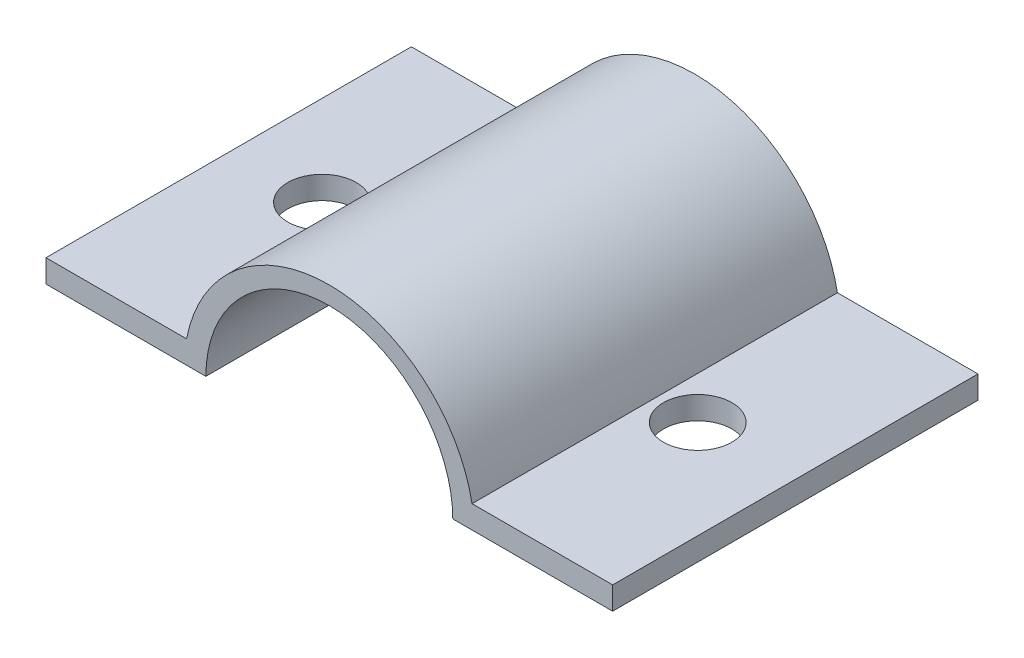
ISO-10303-21;
HEADER;
FILE_DESCRIPTION(('STEP AP214'),'2;1');
FILE_NAME('part.step','',(''),(''),'','','');
FILE_SCHEMA(('AUTOMOTIVE_DESIGN { 1 0 10303 214 1 1 1 1 }'));
ENDSEC;
DATA;
#1=APPLICATION_CONTEXT('core data for automotive mechanical design processes');
#2=APPLICATION_PROTOCOL_DEFINITION('international standard','automotive_design',2000,#1);
#3=PRODUCT_CONTEXT('',#1,'mechanical');
#4=PRODUCT('Part','Part','',(#3));
#5=PRODUCT_RELATED_PRODUCT_CATEGORY('part','',(#4));
#6=PRODUCT_DEFINITION_FORMATION('','',#4);
#7=PRODUCT_DEFINITION_CONTEXT('part definition',#1,'design');
#8=PRODUCT_DEFINITION('design','',#6,#7);
#9=PRODUCT_DEFINITION_SHAPE('','',#8);
#10=(LENGTH_UNIT() NAMED_UNIT(*) SI_UNIT(.MILLI.,.METRE.));
#11=(NAMED_UNIT(*) PLANE_ANGLE_UNIT() SI_UNIT($,.RADIAN.));
#12=(NAMED_UNIT(*) SI_UNIT($,.STERADIAN.) SOLID_ANGLE_UNIT());
#13=UNCERTAINTY_MEASURE_WITH_UNIT(LENGTH_MEASURE(1.E-05),#10,'distance_accuracy_value','');
#14=(GEOMETRIC_REPRESENTATION_CONTEXT(3) GLOBAL_UNCERTAINTY_ASSIGNED_CONTEXT((#13)) GLOBAL_UNIT_ASSIGNED_CONTEXT((#10,
#11,#12)) REPRESENTATION_CONTEXT('',''));
#15=CARTESIAN_POINT('',(0.,0.,0.));
#16=DIRECTION('',(0.,0.,1.));
#17=DIRECTION('',(1.,0.,0.));
#18=AXIS2_PLACEMENT_3D('',#15,#16,#17);
#19=CARTESIAN_POINT('',(1.79189292588689,-0.0212672986542654,16.));
#20=DIRECTION('',(0.,0.,-1.));
#21=DIRECTION('',(-1.,0.,0.));
#22=AXIS2_PLACEMENT_3D('',#19,#20,#21);
#23=CYLINDRICAL_SURFACE('',#22,5.4075061985006);
#24=CARTESIAN_POINT('',(1.79189292588689,-0.0212672986542654,0.));
#25=DIRECTION('',(0.,0.,-1.));
#26=DIRECTION('',(-1.,0.,0.));
#27=AXIS2_PLACEMENT_3D('',#24,#25,#26);
#28=CIRCLE('',#27,5.4075061985006);
#29=CARTESIAN_POINT('',(-3.61557145114144,0.,0.));
#30=VERTEX_POINT('',#29);
#31=CARTESIAN_POINT('',(7.19935730291522,0.,0.));
#32=VERTEX_POINT('',#31);
#33=EDGE_CURVE('E147',#30,#32,#28,.T.);
#34=ORIENTED_EDGE('',*,*,#33,.T.);
#35=DIRECTION('',(0.,0.,-1.));
#36=VECTOR('',#35,1.);
#37=CARTESIAN_POINT('',(7.19935730291522,0.,16.));
#38=LINE('',#37,#36);
#39=CARTESIAN_POINT('',(7.19935730291522,0.,16.));
#40=VERTEX_POINT('',#39);
#41=EDGE_CURVE('E11',#40,#32,#38,.T.);
#42=ORIENTED_EDGE('',*,*,#41,.F.);
#43=CARTESIAN_POINT('',(1.79189292588689,-0.0212672986542654,16.));
#44=DIRECTION('',(0.,0.,-1.));
#45=DIRECTION('',(-1.,0.,0.));
#46=AXIS2_PLACEMENT_3D('',#43,#44,#45);
#47=CIRCLE('',#46,5.4075061985006);
#48=CARTESIAN_POINT('',(-3.61557145114144,0.,16.));
#49=VERTEX_POINT('',#48);
#50=EDGE_CURVE('E170',#49,#40,#47,.T.);
#51=ORIENTED_EDGE('',*,*,#50,.F.);
#52=DIRECTION('',(0.,0.,-1.));
#53=VECTOR('',#52,1.);
#54=CARTESIAN_POINT('',(-3.61557145114144,0.,16.));
#55=LINE('',#54,#53);
#56=EDGE_CURVE('E143',#49,#30,#55,.T.);
#57=ORIENTED_EDGE('',*,*,#56,.T.);
#58=EDGE_LOOP('',(#34,#42,#51,#57));
#59=FACE_BOUND('',#58,.T.);
#60=ADVANCED_FACE('F45',(#59),#23,.F.);
#61=CARTESIAN_POINT('',(7.19935730291522,0.,16.));
#62=DIRECTION('',(0.,1.,0.));
#63=DIRECTION('',(-1.,0.,0.));
#64=AXIS2_PLACEMENT_3D('',#61,#62,#63);
#65=PLANE('',#64);
#66=CARTESIAN_POINT('',(9.90053708975452,0.,7.97704872424694));
#67=DIRECTION('',(0.,1.,0.));
#68=DIRECTION('',(-1.,0.,0.));
#69=AXIS2_PLACEMENT_3D('',#66,#67,#68);
#70=CIRCLE('',#69,1.5);
#71=CARTESIAN_POINT('',(8.40053708975452,0.,7.97704872424694));
#72=VERTEX_POINT('',#71);
#73=EDGE_CURVE('E152',#72,#72,#70,.T.);
#74=ORIENTED_EDGE('',*,*,#73,.T.);
#75=EDGE_LOOP('',(#74));
#76=FACE_BOUND('',#75,.T.);
#77=DIRECTION('',(1.,0.,0.));
#78=VECTOR('',#77,1.);
#79=CARTESIAN_POINT('',(7.19935730291522,0.,0.));
#80=LINE('',#79,#78);
#81=CARTESIAN_POINT('',(14.1993573029152,0.,0.));
#82=VERTEX_POINT('',#81);
#83=EDGE_CURVE('E151',#32,#82,#80,.T.);
#84=ORIENTED_EDGE('',*,*,#83,.T.);
#85=DIRECTION('',(0.,0.,-1.));
#86=VECTOR('',#85,1.);
#87=CARTESIAN_POINT('',(14.1993573029152,0.,16.));
#88=LINE('',#87,#86);
#89=CARTESIAN_POINT('',(14.1993573029152,0.,16.));
#90=VERTEX_POINT('',#89);
#91=EDGE_CURVE('E55',#90,#82,#88,.T.);
#92=ORIENTED_EDGE('',*,*,#91,.F.);
#93=DIRECTION('',(1.,0.,0.));
#94=VECTOR('',#93,1.);
#95=CARTESIAN_POINT('',(7.19935730291522,0.,16.));
#96=LINE('',#95,#94);
#97=EDGE_CURVE('E106',#40,#90,#96,.T.);
#98=ORIENTED_EDGE('',*,*,#97,.F.);
#99=ORIENTED_EDGE('',*,*,#41,.T.);
#100=EDGE_LOOP('',(#84,#92,#98,#99));
#101=FACE_BOUND('',#100,.T.);
#102=ADVANCED_FACE('F246',(#76,#101),#65,.F.);
#103=CARTESIAN_POINT('',(14.1993573029152,0.,16.));
#104=DIRECTION('',(-1.,0.,0.));
#105=DIRECTION('',(0.,0.,1.));
#106=AXIS2_PLACEMENT_3D('',#103,#104,#105);
#107=PLANE('',#106);
#108=DIRECTION('',(0.,1.,0.));
#109=VECTOR('',#108,1.);
#110=CARTESIAN_POINT('',(14.1993573029152,0.,0.));
#111=LINE('',#110,#109);
#112=CARTESIAN_POINT('',(14.1993573029152,1.,0.));
#113=VERTEX_POINT('',#112);
#114=EDGE_CURVE('E155',#82,#113,#111,.T.);
#115=ORIENTED_EDGE('',*,*,#114,.T.);
#116=DIRECTION('',(0.,0.,-1.));
#117=VECTOR('',#116,1.);
#118=CARTESIAN_POINT('',(14.1993573029152,1.,16.));
#119=LINE('',#118,#117);
#120=CARTESIAN_POINT('',(14.1993573029152,1.,16.));
#121=VERTEX_POINT('',#120);
#122=EDGE_CURVE('E181',#121,#113,#119,.T.);
#123=ORIENTED_EDGE('',*,*,#122,.F.);
#124=DIRECTION('',(0.,1.,0.));
#125=VECTOR('',#124,1.);
#126=CARTESIAN_POINT('',(14.1993573029152,0.,16.));
#127=LINE('',#126,#125);
#128=EDGE_CURVE('E192',#90,#121,#127,.T.);
#129=ORIENTED_EDGE('',*,*,#128,.F.);
#130=ORIENTED_EDGE('',*,*,#91,.T.);
#131=EDGE_LOOP('',(#115,#123,#129,#130));
#132=FACE_BOUND('',#131,.T.);
#133=ADVANCED_FACE('F190',(#132),#107,.F.);
#134=CARTESIAN_POINT('',(14.1993573029152,1.,16.));
#135=DIRECTION('',(0.,-1.,0.));
#136=DIRECTION('',(0.,0.,-1.));
#137=AXIS2_PLACEMENT_3D('',#134,#135,#136);
#138=PLANE('',#137);
#139=CARTESIAN_POINT('',(9.90053708975452,0.999999999999999,7.97704872424694));
#140=DIRECTION('',(0.,1.,0.));
#141=DIRECTION('',(0.,0.,1.));
#142=AXIS2_PLACEMENT_3D('',#139,#140,#141);
#143=CIRCLE('',#142,1.5);
#144=CARTESIAN_POINT('',(9.90053708975452,0.999999999999999,9.47704872424694));
#145=VERTEX_POINT('',#144);
#146=EDGE_CURVE('E218',#145,#145,#143,.T.);
#147=ORIENTED_EDGE('',*,*,#146,.F.);
#148=EDGE_LOOP('',(#147));
#149=FACE_BOUND('',#148,.T.);
#150=DIRECTION('',(-1.,0.,0.));
#151=VECTOR('',#150,1.);
#152=CARTESIAN_POINT('',(14.1993573029152,1.,0.));
#153=LINE('',#152,#151);
#154=CARTESIAN_POINT('',(8.04210041016385,1.,0.));
#155=VERTEX_POINT('',#154);
#156=EDGE_CURVE('E158',#113,#155,#153,.T.);
#157=ORIENTED_EDGE('',*,*,#156,.T.);
#158=DIRECTION('',(0.,0.,-1.));
#159=VECTOR('',#158,1.);
#160=CARTESIAN_POINT('',(8.04210041016385,1.,16.));
#161=LINE('',#160,#159);
#162=CARTESIAN_POINT('',(8.04210041016385,1.,16.));
#163=VERTEX_POINT('',#162);
#164=EDGE_CURVE('E177',#163,#155,#161,.T.);
#165=ORIENTED_EDGE('',*,*,#164,.F.);
#166=DIRECTION('',(-1.,0.,0.));
#167=VECTOR('',#166,1.);
#168=CARTESIAN_POINT('',(14.1993573029152,1.,16.));
#169=LINE('',#168,#167);
#170=EDGE_CURVE('E205',#121,#163,#169,.T.);
#171=ORIENTED_EDGE('',*,*,#170,.F.);
#172=ORIENTED_EDGE('',*,*,#122,.T.);
#173=EDGE_LOOP('',(#157,#165,#171,#172));
#174=FACE_BOUND('',#173,.T.);
#175=ADVANCED_FACE('F200',(#149,#174),#138,.F.);
#176=CARTESIAN_POINT('',(1.79189292588689,-0.190024637638568,16.));
#177=DIRECTION('',(0.,0.,-1.));
#178=DIRECTION('',(-1.,0.,0.));
#179=AXIS2_PLACEMENT_3D('',#176,#177,#178);
#180=CYLINDRICAL_SURFACE('',#179,6.36248789662491);
#181=CARTESIAN_POINT('',(1.79189292588689,-0.190024637638568,0.));
#182=DIRECTION('',(0.,0.,1.));
#183=DIRECTION('',(-1.,0.,0.));
#184=AXIS2_PLACEMENT_3D('',#181,#182,#183);
#185=CIRCLE('',#184,6.36248789662491);
#186=CARTESIAN_POINT('',(-4.45831455839007,0.999999999999999,0.));
#187=VERTEX_POINT('',#186);
#188=EDGE_CURVE('E161',#155,#187,#185,.T.);
#189=ORIENTED_EDGE('',*,*,#188,.T.);
#190=DIRECTION('',(0.,0.,-1.));
#191=VECTOR('',#190,1.);
#192=CARTESIAN_POINT('',(-4.45831455839007,0.999999999999999,16.));
#193=LINE('',#192,#191);
#194=CARTESIAN_POINT('',(-4.45831455839007,0.999999999999999,16.));
#195=VERTEX_POINT('',#194);
#196=EDGE_CURVE('E136',#195,#187,#193,.T.);
#197=ORIENTED_EDGE('',*,*,#196,.F.);
#198=CARTESIAN_POINT('',(1.79189292588689,-0.190024637638568,16.));
#199=DIRECTION('',(0.,0.,1.));
#200=DIRECTION('',(-1.,0.,0.));
#201=AXIS2_PLACEMENT_3D('',#198,#199,#200);
#202=CIRCLE('',#201,6.36248789662491);
#203=EDGE_CURVE('E125',#163,#195,#202,.T.);
#204=ORIENTED_EDGE('',*,*,#203,.F.);
#205=ORIENTED_EDGE('',*,*,#164,.T.);
#206=EDGE_LOOP('',(#189,#197,#204,#205));
#207=FACE_BOUND('',#206,.T.);
#208=ADVANCED_FACE('F203',(#207),#180,.T.);
#209=CARTESIAN_POINT('',(-10.6155714511414,0.999999999999999,16.));
#210=DIRECTION('',(0.,-1.,0.));
#211=DIRECTION('',(0.,0.,-1.));
#212=AXIS2_PLACEMENT_3D('',#209,#210,#211);
#213=PLANE('',#212);
#214=CARTESIAN_POINT('',(-6.67515733204719,0.999999999999999,7.85245081483088));
#215=DIRECTION('',(0.,1.,0.));
#216=DIRECTION('',(0.,0.,1.));
#217=AXIS2_PLACEMENT_3D('',#214,#215,#216);
#218=CIRCLE('',#217,1.5);
#219=CARTESIAN_POINT('',(-6.67515733204719,0.999999999999999,9.35245081483088));
#220=VERTEX_POINT('',#219);
#221=EDGE_CURVE('E222',#220,#220,#218,.T.);
#222=ORIENTED_EDGE('',*,*,#221,.F.);
#223=EDGE_LOOP('',(#222));
#224=FACE_BOUND('',#223,.T.);
#225=DIRECTION('',(-1.,0.,0.));
#226=VECTOR('',#225,1.);
#227=CARTESIAN_POINT('',(-10.6155714511414,0.999999999999999,0.));
#228=LINE('',#227,#226);
#229=CARTESIAN_POINT('',(-10.6155714511414,0.999999999999999,0.));
#230=VERTEX_POINT('',#229);
#231=EDGE_CURVE('E134',#187,#230,#228,.T.);
#232=ORIENTED_EDGE('',*,*,#231,.T.);
#233=DIRECTION('',(0.,0.,-1.));
#234=VECTOR('',#233,1.);
#235=CARTESIAN_POINT('',(-10.6155714511414,0.999999999999999,16.));
#236=LINE('',#235,#234);
#237=CARTESIAN_POINT('',(-10.6155714511414,0.999999999999999,16.));
#238=VERTEX_POINT('',#237);
#239=EDGE_CURVE('E131',#238,#230,#236,.T.);
#240=ORIENTED_EDGE('',*,*,#239,.F.);
#241=DIRECTION('',(-1.,0.,0.));
#242=VECTOR('',#241,1.);
#243=CARTESIAN_POINT('',(-10.6155714511414,0.999999999999999,16.));
#244=LINE('',#243,#242);
#245=EDGE_CURVE('E119',#195,#238,#244,.T.);
#246=ORIENTED_EDGE('',*,*,#245,.F.);
#247=ORIENTED_EDGE('',*,*,#196,.T.);
#248=EDGE_LOOP('',(#232,#240,#246,#247));
#249=FACE_BOUND('',#248,.T.);
#250=ADVANCED_FACE('F132',(#224,#249),#213,.F.);
#251=CARTESIAN_POINT('',(-10.6155714511414,0.,16.));
#252=DIRECTION('',(1.,0.,0.));
#253=DIRECTION('',(0.,0.,-1.));
#254=AXIS2_PLACEMENT_3D('',#251,#252,#253);
#255=PLANE('',#254);
#256=DIRECTION('',(0.,-1.,0.));
#257=VECTOR('',#256,1.);
#258=CARTESIAN_POINT('',(-10.6155714511414,0.,0.));
#259=LINE('',#258,#257);
#260=CARTESIAN_POINT('',(-10.6155714511414,0.,0.));
#261=VERTEX_POINT('',#260);
#262=EDGE_CURVE('E92',#230,#261,#259,.T.);
#263=ORIENTED_EDGE('',*,*,#262,.T.);
#264=DIRECTION('',(0.,0.,-1.));
#265=VECTOR('',#264,1.);
#266=CARTESIAN_POINT('',(-10.6155714511414,0.,16.));
#267=LINE('',#266,#265);
#268=CARTESIAN_POINT('',(-10.6155714511414,0.,16.));
#269=VERTEX_POINT('',#268);
#270=EDGE_CURVE('E137',#269,#261,#267,.T.);
#271=ORIENTED_EDGE('',*,*,#270,.F.);
#272=DIRECTION('',(0.,-1.,0.));
#273=VECTOR('',#272,1.);
#274=CARTESIAN_POINT('',(-10.6155714511414,0.,16.));
#275=LINE('',#274,#273);
#276=EDGE_CURVE('E123',#238,#269,#275,.T.);
#277=ORIENTED_EDGE('',*,*,#276,.F.);
#278=ORIENTED_EDGE('',*,*,#239,.T.);
#279=EDGE_LOOP('',(#263,#271,#277,#278));
#280=FACE_BOUND('',#279,.T.);
#281=ADVANCED_FACE('F139',(#280),#255,.F.);
#282=CARTESIAN_POINT('',(-3.61557145114144,0.,16.));
#283=DIRECTION('',(0.,1.,0.));
#284=DIRECTION('',(-1.,0.,0.));
#285=AXIS2_PLACEMENT_3D('',#282,#283,#284);
#286=PLANE('',#285);
#287=CARTESIAN_POINT('',(-6.67515733204719,0.,7.85245081483088));
#288=DIRECTION('',(0.,1.,0.));
#289=DIRECTION('',(-1.,0.,0.));
#290=AXIS2_PLACEMENT_3D('',#287,#288,#289);
#291=CIRCLE('',#290,1.5);
#292=CARTESIAN_POINT('',(-8.17515733204719,0.,7.85245081483088));
#293=VERTEX_POINT('',#292);
#294=EDGE_CURVE('E48',#293,#293,#291,.T.);
#295=ORIENTED_EDGE('',*,*,#294,.T.);
#296=EDGE_LOOP('',(#295));
#297=FACE_BOUND('',#296,.T.);
#298=DIRECTION('',(1.,0.,0.));
#299=VECTOR('',#298,1.);
#300=CARTESIAN_POINT('',(-3.61557145114144,0.,0.));
#301=LINE('',#300,#299);
#302=EDGE_CURVE('E98',#261,#30,#301,.T.);
#303=ORIENTED_EDGE('',*,*,#302,.T.);
#304=ORIENTED_EDGE('',*,*,#56,.F.);
#305=DIRECTION('',(1.,0.,0.));
#306=VECTOR('',#305,1.);
#307=CARTESIAN_POINT('',(-3.61557145114144,0.,16.));
#308=LINE('',#307,#306);
#309=EDGE_CURVE('E63',#269,#49,#308,.T.);
#310=ORIENTED_EDGE('',*,*,#309,.F.);
#311=ORIENTED_EDGE('',*,*,#270,.T.);
#312=EDGE_LOOP('',(#303,#304,#310,#311));
#313=FACE_BOUND('',#312,.T.);
#314=ADVANCED_FACE('F231',(#297,#313),#286,.F.);
#315=CARTESIAN_POINT('',(1.79189292588689,-0.0212672986542654,16.));
#316=DIRECTION('',(0.,0.,-1.));
#317=DIRECTION('',(-1.,0.,0.));
#318=AXIS2_PLACEMENT_3D('',#315,#316,#317);
#319=PLANE('',#318);
#320=ORIENTED_EDGE('',*,*,#50,.T.);
#321=ORIENTED_EDGE('',*,*,#97,.T.);
#322=ORIENTED_EDGE('',*,*,#128,.T.);
#323=ORIENTED_EDGE('',*,*,#170,.T.);
#324=ORIENTED_EDGE('',*,*,#203,.T.);
#325=ORIENTED_EDGE('',*,*,#245,.T.);
#326=ORIENTED_EDGE('',*,*,#276,.T.);
#327=ORIENTED_EDGE('',*,*,#309,.T.);
#328=EDGE_LOOP('',(#320,#321,#322,#323,#324,#325,#326,#327));
#329=FACE_BOUND('',#328,.T.);
#330=ADVANCED_FACE('F121',(#329),#319,.F.);
#331=CARTESIAN_POINT('',(1.79189292588689,-0.0212672986542654,0.));
#332=DIRECTION('',(0.,0.,-1.));
#333=DIRECTION('',(-1.,0.,0.));
#334=AXIS2_PLACEMENT_3D('',#331,#332,#333);
#335=PLANE('',#334);
#336=ORIENTED_EDGE('',*,*,#33,.F.);
#337=ORIENTED_EDGE('',*,*,#302,.F.);
#338=ORIENTED_EDGE('',*,*,#262,.F.);
#339=ORIENTED_EDGE('',*,*,#231,.F.);
#340=ORIENTED_EDGE('',*,*,#188,.F.);
#341=ORIENTED_EDGE('',*,*,#156,.F.);
#342=ORIENTED_EDGE('',*,*,#114,.F.);
#343=ORIENTED_EDGE('',*,*,#83,.F.);
#344=EDGE_LOOP('',(#336,#337,#338,#339,#340,#341,#342,#343));
#345=FACE_BOUND('',#344,.T.);
#346=ADVANCED_FACE('F196',(#345),#335,.T.);
#347=CARTESIAN_POINT('',(-6.67515733204719,-5.,7.85245081483088));
#348=DIRECTION('',(0.,1.,0.));
#349=DIRECTION('',(0.,0.,1.));
#350=AXIS2_PLACEMENT_3D('',#347,#348,#349);
#351=CYLINDRICAL_SURFACE('',#350,1.5);
#352=ORIENTED_EDGE('',*,*,#221,.T.);
#353=EDGE_LOOP('',(#352));
#354=FACE_BOUND('',#353,.T.);
#355=ORIENTED_EDGE('',*,*,#294,.F.);
#356=EDGE_LOOP('',(#355));
#357=FACE_BOUND('',#356,.T.);
#358=ADVANCED_FACE('F233',(#354,#357),#351,.F.);
#359=CARTESIAN_POINT('',(9.90053708975452,-5.,7.97704872424694));
#360=DIRECTION('',(0.,1.,0.));
#361=DIRECTION('',(0.,0.,1.));
#362=AXIS2_PLACEMENT_3D('',#359,#360,#361);
#363=CYLINDRICAL_SURFACE('',#362,1.5);
#364=ORIENTED_EDGE('',*,*,#146,.T.);
#365=EDGE_LOOP('',(#364));
#366=FACE_BOUND('',#365,.T.);
#367=ORIENTED_EDGE('',*,*,#73,.F.);
#368=EDGE_LOOP('',(#367));
#369=FACE_BOUND('',#368,.T.);
#370=ADVANCED_FACE('F235',(#366,#369),#363,.F.);
#371=CLOSED_SHELL('',(#60,#102,#133,#175,#208,#250,#281,#314,#330,#346,#358,#370));
#372=MANIFOLD_SOLID_BREP('B2',#371);
#373=ADVANCED_BREP_SHAPE_REPRESENTATION('',(#18,#372),#14);
#374=SHAPE_DEFINITION_REPRESENTATION(#9,#373);
ENDSEC;
END-ISO-10303-21;
